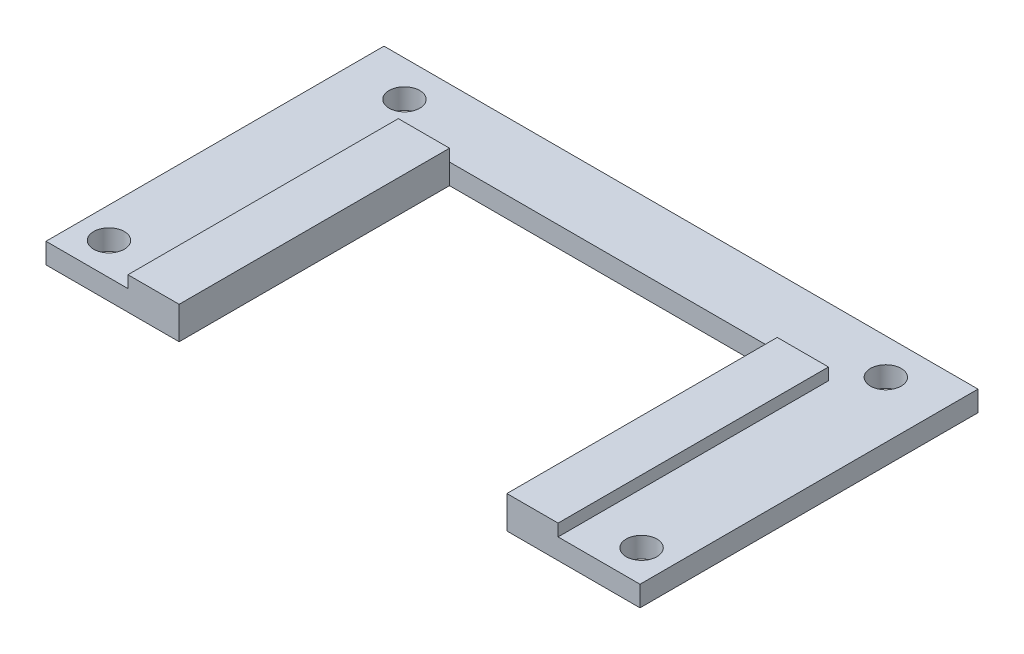
ISO-10303-21;
HEADER;
FILE_DESCRIPTION(('STEP AP214'),'2;1');
FILE_NAME('part.step','',(''),(''),'','','');
FILE_SCHEMA(('AUTOMOTIVE_DESIGN { 1 0 10303 214 1 1 1 1 }'));
ENDSEC;
DATA;
#1=APPLICATION_CONTEXT('core data for automotive mechanical design processes');
#2=APPLICATION_PROTOCOL_DEFINITION('international standard','automotive_design',2000,#1);
#3=PRODUCT_CONTEXT('',#1,'mechanical');
#4=PRODUCT('Part','Part','',(#3));
#5=PRODUCT_RELATED_PRODUCT_CATEGORY('part','',(#4));
#6=PRODUCT_DEFINITION_FORMATION('','',#4);
#7=PRODUCT_DEFINITION_CONTEXT('part definition',#1,'design');
#8=PRODUCT_DEFINITION('design','',#6,#7);
#9=PRODUCT_DEFINITION_SHAPE('','',#8);
#10=(LENGTH_UNIT() NAMED_UNIT(*) SI_UNIT(.MILLI.,.METRE.));
#11=(NAMED_UNIT(*) PLANE_ANGLE_UNIT() SI_UNIT($,.RADIAN.));
#12=(NAMED_UNIT(*) SI_UNIT($,.STERADIAN.) SOLID_ANGLE_UNIT());
#13=UNCERTAINTY_MEASURE_WITH_UNIT(LENGTH_MEASURE(1.E-05),#10,'distance_accuracy_value','');
#14=(GEOMETRIC_REPRESENTATION_CONTEXT(3) GLOBAL_UNCERTAINTY_ASSIGNED_CONTEXT((#13)) GLOBAL_UNIT_ASSIGNED_CONTEXT((#10,
#11,#12)) REPRESENTATION_CONTEXT('',''));
#15=CARTESIAN_POINT('',(0.,0.,0.));
#16=DIRECTION('',(0.,0.,1.));
#17=DIRECTION('',(1.,0.,0.));
#18=AXIS2_PLACEMENT_3D('',#15,#16,#17);
#19=CARTESIAN_POINT('',(0.,2.,0.));
#20=DIRECTION('',(0.,1.,0.));
#21=DIRECTION('',(0.,0.,1.));
#22=AXIS2_PLACEMENT_3D('',#19,#20,#21);
#23=PLANE('',#22);
#24=CARTESIAN_POINT('',(52.,2.,-3.15));
#25=DIRECTION('',(0.,1.,0.));
#26=DIRECTION('',(0.,0.,1.));
#27=AXIS2_PLACEMENT_3D('',#24,#25,#26);
#28=CIRCLE('',#27,1.5);
#29=CARTESIAN_POINT('',(52.,2.,-1.65));
#30=VERTEX_POINT('',#29);
#31=EDGE_CURVE('E243',#30,#30,#28,.T.);
#32=ORIENTED_EDGE('',*,*,#31,.F.);
#33=EDGE_LOOP('',(#32));
#34=FACE_BOUND('',#33,.T.);
#35=CARTESIAN_POINT('',(49.5,2.,-29.5));
#36=DIRECTION('',(0.,1.,0.));
#37=DIRECTION('',(0.,0.,1.));
#38=AXIS2_PLACEMENT_3D('',#35,#36,#37);
#39=CIRCLE('',#38,1.5);
#40=CARTESIAN_POINT('',(49.5,2.,-28.));
#41=VERTEX_POINT('',#40);
#42=EDGE_CURVE('E247',#41,#41,#39,.T.);
#43=ORIENTED_EDGE('',*,*,#42,.F.);
#44=EDGE_LOOP('',(#43));
#45=FACE_BOUND('',#44,.T.);
#46=CARTESIAN_POINT('',(2.5,2.,-29.5));
#47=DIRECTION('',(0.,1.,0.));
#48=DIRECTION('',(0.,0.,1.));
#49=AXIS2_PLACEMENT_3D('',#46,#47,#48);
#50=CIRCLE('',#49,1.5);
#51=CARTESIAN_POINT('',(2.5,2.,-28.));
#52=VERTEX_POINT('',#51);
#53=EDGE_CURVE('E253',#52,#52,#50,.T.);
#54=ORIENTED_EDGE('',*,*,#53,.F.);
#55=EDGE_LOOP('',(#54));
#56=FACE_BOUND('',#55,.T.);
#57=CARTESIAN_POINT('',(0.,2.,-3.15));
#58=DIRECTION('',(0.,1.,0.));
#59=DIRECTION('',(0.,0.,1.));
#60=AXIS2_PLACEMENT_3D('',#57,#58,#59);
#61=CIRCLE('',#60,1.5);
#62=CARTESIAN_POINT('',(0.,2.,-1.65));
#63=VERTEX_POINT('',#62);
#64=EDGE_CURVE('E169',#63,#63,#61,.T.);
#65=ORIENTED_EDGE('',*,*,#64,.F.);
#66=EDGE_LOOP('',(#65));
#67=FACE_BOUND('',#66,.T.);
#68=DIRECTION('',(-1.,0.,0.));
#69=VECTOR('',#68,1.);
#70=CARTESIAN_POINT('',(42.,2.,-26.4));
#71=LINE('',#70,#69);
#72=CARTESIAN_POINT('',(47.,2.,-26.4));
#73=VERTEX_POINT('',#72);
#74=CARTESIAN_POINT('',(42.,2.,-26.4));
#75=VERTEX_POINT('',#74);
#76=EDGE_CURVE('E140',#73,#75,#71,.T.);
#77=ORIENTED_EDGE('',*,*,#76,.F.);
#78=DIRECTION('',(0.,0.,-1.));
#79=VECTOR('',#78,1.);
#80=CARTESIAN_POINT('',(47.,2.,0.));
#81=LINE('',#80,#79);
#82=CARTESIAN_POINT('',(47.,2.,0.));
#83=VERTEX_POINT('',#82);
#84=EDGE_CURVE('E148',#83,#73,#81,.T.);
#85=ORIENTED_EDGE('',*,*,#84,.F.);
#86=DIRECTION('',(-1.,0.,0.));
#87=VECTOR('',#86,1.);
#88=CARTESIAN_POINT('',(0.,2.,0.));
#89=LINE('',#88,#87);
#90=CARTESIAN_POINT('',(55.,2.,0.));
#91=VERTEX_POINT('',#90);
#92=EDGE_CURVE('E262',#91,#83,#89,.T.);
#93=ORIENTED_EDGE('',*,*,#92,.F.);
#94=DIRECTION('',(0.,0.,1.));
#95=VECTOR('',#94,1.);
#96=CARTESIAN_POINT('',(55.,2.,0.));
#97=LINE('',#96,#95);
#98=CARTESIAN_POINT('',(55.,2.,-33.));
#99=VERTEX_POINT('',#98);
#100=EDGE_CURVE('E207',#99,#91,#97,.T.);
#101=ORIENTED_EDGE('',*,*,#100,.F.);
#102=DIRECTION('',(1.,0.,0.));
#103=VECTOR('',#102,1.);
#104=CARTESIAN_POINT('',(0.,2.,-33.));
#105=LINE('',#104,#103);
#106=CARTESIAN_POINT('',(-3.,2.,-33.));
#107=VERTEX_POINT('',#106);
#108=EDGE_CURVE('E267',#107,#99,#105,.T.);
#109=ORIENTED_EDGE('',*,*,#108,.F.);
#110=DIRECTION('',(0.,0.,-1.));
#111=VECTOR('',#110,1.);
#112=CARTESIAN_POINT('',(-3.,2.,0.));
#113=LINE('',#112,#111);
#114=CARTESIAN_POINT('',(-3.,2.,0.));
#115=VERTEX_POINT('',#114);
#116=EDGE_CURVE('E271',#115,#107,#113,.T.);
#117=ORIENTED_EDGE('',*,*,#116,.F.);
#118=DIRECTION('',(-1.,0.,0.));
#119=VECTOR('',#118,1.);
#120=CARTESIAN_POINT('',(0.,2.,0.));
#121=LINE('',#120,#119);
#122=CARTESIAN_POINT('',(5.,2.,0.));
#123=VERTEX_POINT('',#122);
#124=EDGE_CURVE('E69',#123,#115,#121,.T.);
#125=ORIENTED_EDGE('',*,*,#124,.F.);
#126=DIRECTION('',(0.,0.,1.));
#127=VECTOR('',#126,1.);
#128=CARTESIAN_POINT('',(5.,2.,0.));
#129=LINE('',#128,#127);
#130=CARTESIAN_POINT('',(5.,2.,-26.4));
#131=VERTEX_POINT('',#130);
#132=EDGE_CURVE('E308',#131,#123,#129,.T.);
#133=ORIENTED_EDGE('',*,*,#132,.F.);
#134=DIRECTION('',(-1.,0.,0.));
#135=VECTOR('',#134,1.);
#136=CARTESIAN_POINT('',(10.,2.,-26.4));
#137=LINE('',#136,#135);
#138=CARTESIAN_POINT('',(10.,2.,-26.4));
#139=VERTEX_POINT('',#138);
#140=EDGE_CURVE('E164',#139,#131,#137,.T.);
#141=ORIENTED_EDGE('',*,*,#140,.F.);
#142=DIRECTION('',(1.,0.,0.));
#143=VECTOR('',#142,1.);
#144=CARTESIAN_POINT('',(0.,2.,-26.4));
#145=LINE('',#144,#143);
#146=EDGE_CURVE('E162',#139,#75,#145,.T.);
#147=ORIENTED_EDGE('',*,*,#146,.T.);
#148=EDGE_LOOP('',(#77,#85,#93,#101,#109,#117,#125,#133,#141,#147));
#149=FACE_BOUND('',#148,.T.);
#150=ADVANCED_FACE('F45',(#34,#45,#56,#67,#149),#23,.T.);
#151=CARTESIAN_POINT('',(42.,2.,0.));
#152=DIRECTION('',(-1.,0.,0.));
#153=DIRECTION('',(0.,0.,1.));
#154=AXIS2_PLACEMENT_3D('',#151,#152,#153);
#155=PLANE('',#154);
#156=DIRECTION('',(0.,0.,-1.));
#157=VECTOR('',#156,1.);
#158=CARTESIAN_POINT('',(42.,0.,0.));
#159=LINE('',#158,#157);
#160=CARTESIAN_POINT('',(42.,0.,0.));
#161=VERTEX_POINT('',#160);
#162=CARTESIAN_POINT('',(42.,0.,-26.4));
#163=VERTEX_POINT('',#162);
#164=EDGE_CURVE('E217',#161,#163,#159,.T.);
#165=ORIENTED_EDGE('',*,*,#164,.F.);
#166=DIRECTION('',(0.,-1.,0.));
#167=VECTOR('',#166,1.);
#168=CARTESIAN_POINT('',(42.,2.,0.));
#169=LINE('',#168,#167);
#170=CARTESIAN_POINT('',(42.,3.17,0.));
#171=VERTEX_POINT('',#170);
#172=EDGE_CURVE('E11',#171,#161,#169,.T.);
#173=ORIENTED_EDGE('',*,*,#172,.F.);
#174=DIRECTION('',(0.,0.,1.));
#175=VECTOR('',#174,1.);
#176=CARTESIAN_POINT('',(42.,3.17,0.));
#177=LINE('',#176,#175);
#178=CARTESIAN_POINT('',(42.,3.17,-26.4));
#179=VERTEX_POINT('',#178);
#180=EDGE_CURVE('E149',#179,#171,#177,.T.);
#181=ORIENTED_EDGE('',*,*,#180,.F.);
#182=DIRECTION('',(0.,-1.,0.));
#183=VECTOR('',#182,1.);
#184=CARTESIAN_POINT('',(42.,3.17,-26.4));
#185=LINE('',#184,#183);
#186=EDGE_CURVE('E143',#179,#75,#185,.T.);
#187=ORIENTED_EDGE('',*,*,#186,.T.);
#188=DIRECTION('',(0.,-1.,0.));
#189=VECTOR('',#188,1.);
#190=CARTESIAN_POINT('',(42.,2.,-26.4));
#191=LINE('',#190,#189);
#192=EDGE_CURVE('E155',#75,#163,#191,.T.);
#193=ORIENTED_EDGE('',*,*,#192,.T.);
#194=EDGE_LOOP('',(#165,#173,#181,#187,#193));
#195=FACE_BOUND('',#194,.T.);
#196=ADVANCED_FACE('F153',(#195),#155,.T.);
#197=CARTESIAN_POINT('',(0.,2.,0.));
#198=DIRECTION('',(0.,0.,1.));
#199=DIRECTION('',(1.,0.,0.));
#200=AXIS2_PLACEMENT_3D('',#197,#198,#199);
#201=PLANE('',#200);
#202=DIRECTION('',(-1.,0.,0.));
#203=VECTOR('',#202,1.);
#204=CARTESIAN_POINT('',(0.,0.,0.));
#205=LINE('',#204,#203);
#206=CARTESIAN_POINT('',(55.,0.,0.));
#207=VERTEX_POINT('',#206);
#208=EDGE_CURVE('E212',#207,#161,#205,.T.);
#209=ORIENTED_EDGE('',*,*,#208,.F.);
#210=DIRECTION('',(0.,-1.,0.));
#211=VECTOR('',#210,1.);
#212=CARTESIAN_POINT('',(55.,2.,0.));
#213=LINE('',#212,#211);
#214=EDGE_CURVE('E54',#91,#207,#213,.T.);
#215=ORIENTED_EDGE('',*,*,#214,.F.);
#216=ORIENTED_EDGE('',*,*,#92,.T.);
#217=DIRECTION('',(0.,-1.,0.));
#218=VECTOR('',#217,1.);
#219=CARTESIAN_POINT('',(47.,3.17,0.));
#220=LINE('',#219,#218);
#221=CARTESIAN_POINT('',(47.,3.17,0.));
#222=VERTEX_POINT('',#221);
#223=EDGE_CURVE('E292',#222,#83,#220,.T.);
#224=ORIENTED_EDGE('',*,*,#223,.F.);
#225=DIRECTION('',(1.,0.,0.));
#226=VECTOR('',#225,1.);
#227=CARTESIAN_POINT('',(42.,3.17,0.));
#228=LINE('',#227,#226);
#229=EDGE_CURVE('E291',#171,#222,#228,.T.);
#230=ORIENTED_EDGE('',*,*,#229,.F.);
#231=ORIENTED_EDGE('',*,*,#172,.T.);
#232=EDGE_LOOP('',(#209,#215,#216,#224,#230,#231));
#233=FACE_BOUND('',#232,.T.);
#234=ADVANCED_FACE('F213',(#233),#201,.T.);
#235=CARTESIAN_POINT('',(55.,2.,0.));
#236=DIRECTION('',(1.,0.,0.));
#237=DIRECTION('',(0.,0.,-1.));
#238=AXIS2_PLACEMENT_3D('',#235,#236,#237);
#239=PLANE('',#238);
#240=DIRECTION('',(0.,0.,1.));
#241=VECTOR('',#240,1.);
#242=CARTESIAN_POINT('',(55.,0.,0.));
#243=LINE('',#242,#241);
#244=CARTESIAN_POINT('',(55.,0.,-33.));
#245=VERTEX_POINT('',#244);
#246=EDGE_CURVE('E204',#245,#207,#243,.T.);
#247=ORIENTED_EDGE('',*,*,#246,.F.);
#248=DIRECTION('',(0.,-1.,0.));
#249=VECTOR('',#248,1.);
#250=CARTESIAN_POINT('',(55.,2.,-33.));
#251=LINE('',#250,#249);
#252=EDGE_CURVE('E195',#99,#245,#251,.T.);
#253=ORIENTED_EDGE('',*,*,#252,.F.);
#254=ORIENTED_EDGE('',*,*,#100,.T.);
#255=ORIENTED_EDGE('',*,*,#214,.T.);
#256=EDGE_LOOP('',(#247,#253,#254,#255));
#257=FACE_BOUND('',#256,.T.);
#258=ADVANCED_FACE('F202',(#257),#239,.T.);
#259=CARTESIAN_POINT('',(0.,2.,-33.));
#260=DIRECTION('',(0.,0.,-1.));
#261=DIRECTION('',(-1.,0.,0.));
#262=AXIS2_PLACEMENT_3D('',#259,#260,#261);
#263=PLANE('',#262);
#264=DIRECTION('',(1.,0.,0.));
#265=VECTOR('',#264,1.);
#266=CARTESIAN_POINT('',(0.,0.,-33.));
#267=LINE('',#266,#265);
#268=CARTESIAN_POINT('',(-3.,0.,-33.));
#269=VERTEX_POINT('',#268);
#270=EDGE_CURVE('E223',#269,#245,#267,.T.);
#271=ORIENTED_EDGE('',*,*,#270,.F.);
#272=DIRECTION('',(0.,-1.,0.));
#273=VECTOR('',#272,1.);
#274=CARTESIAN_POINT('',(-3.,2.,-33.));
#275=LINE('',#274,#273);
#276=EDGE_CURVE('E192',#107,#269,#275,.T.);
#277=ORIENTED_EDGE('',*,*,#276,.F.);
#278=ORIENTED_EDGE('',*,*,#108,.T.);
#279=ORIENTED_EDGE('',*,*,#252,.T.);
#280=EDGE_LOOP('',(#271,#277,#278,#279));
#281=FACE_BOUND('',#280,.T.);
#282=ADVANCED_FACE('F349',(#281),#263,.T.);
#283=CARTESIAN_POINT('',(-3.,2.,0.));
#284=DIRECTION('',(-1.,0.,0.));
#285=DIRECTION('',(0.,0.,1.));
#286=AXIS2_PLACEMENT_3D('',#283,#284,#285);
#287=PLANE('',#286);
#288=DIRECTION('',(0.,0.,-1.));
#289=VECTOR('',#288,1.);
#290=CARTESIAN_POINT('',(-3.,0.,0.));
#291=LINE('',#290,#289);
#292=CARTESIAN_POINT('',(-3.,0.,0.));
#293=VERTEX_POINT('',#292);
#294=EDGE_CURVE('E227',#293,#269,#291,.T.);
#295=ORIENTED_EDGE('',*,*,#294,.F.);
#296=DIRECTION('',(0.,-1.,0.));
#297=VECTOR('',#296,1.);
#298=CARTESIAN_POINT('',(-3.,2.,0.));
#299=LINE('',#298,#297);
#300=EDGE_CURVE('E189',#115,#293,#299,.T.);
#301=ORIENTED_EDGE('',*,*,#300,.F.);
#302=ORIENTED_EDGE('',*,*,#116,.T.);
#303=ORIENTED_EDGE('',*,*,#276,.T.);
#304=EDGE_LOOP('',(#295,#301,#302,#303));
#305=FACE_BOUND('',#304,.T.);
#306=ADVANCED_FACE('F346',(#305),#287,.T.);
#307=CARTESIAN_POINT('',(0.,2.,0.));
#308=DIRECTION('',(0.,0.,1.));
#309=DIRECTION('',(1.,0.,0.));
#310=AXIS2_PLACEMENT_3D('',#307,#308,#309);
#311=PLANE('',#310);
#312=DIRECTION('',(-1.,0.,0.));
#313=VECTOR('',#312,1.);
#314=CARTESIAN_POINT('',(0.,0.,0.));
#315=LINE('',#314,#313);
#316=CARTESIAN_POINT('',(10.,0.,0.));
#317=VERTEX_POINT('',#316);
#318=EDGE_CURVE('E233',#317,#293,#315,.T.);
#319=ORIENTED_EDGE('',*,*,#318,.F.);
#320=DIRECTION('',(0.,-1.,0.));
#321=VECTOR('',#320,1.);
#322=CARTESIAN_POINT('',(10.,2.,0.));
#323=LINE('',#322,#321);
#324=CARTESIAN_POINT('',(10.,3.17,0.));
#325=VERTEX_POINT('',#324);
#326=EDGE_CURVE('E179',#325,#317,#323,.T.);
#327=ORIENTED_EDGE('',*,*,#326,.F.);
#328=DIRECTION('',(1.,0.,0.));
#329=VECTOR('',#328,1.);
#330=CARTESIAN_POINT('',(10.,3.17,0.));
#331=LINE('',#330,#329);
#332=CARTESIAN_POINT('',(5.,3.17,0.));
#333=VERTEX_POINT('',#332);
#334=EDGE_CURVE('E314',#333,#325,#331,.T.);
#335=ORIENTED_EDGE('',*,*,#334,.F.);
#336=DIRECTION('',(0.,-1.,0.));
#337=VECTOR('',#336,1.);
#338=CARTESIAN_POINT('',(5.,3.17,0.));
#339=LINE('',#338,#337);
#340=EDGE_CURVE('E318',#333,#123,#339,.T.);
#341=ORIENTED_EDGE('',*,*,#340,.T.);
#342=ORIENTED_EDGE('',*,*,#124,.T.);
#343=ORIENTED_EDGE('',*,*,#300,.T.);
#344=EDGE_LOOP('',(#319,#327,#335,#341,#342,#343));
#345=FACE_BOUND('',#344,.T.);
#346=ADVANCED_FACE('F341',(#345),#311,.T.);
#347=CARTESIAN_POINT('',(10.,2.,0.));
#348=DIRECTION('',(-1.,0.,0.));
#349=DIRECTION('',(0.,0.,1.));
#350=AXIS2_PLACEMENT_3D('',#347,#348,#349);
#351=PLANE('',#350);
#352=DIRECTION('',(0.,0.,-1.));
#353=VECTOR('',#352,1.);
#354=CARTESIAN_POINT('',(10.,0.,0.));
#355=LINE('',#354,#353);
#356=CARTESIAN_POINT('',(10.,0.,-26.4));
#357=VERTEX_POINT('',#356);
#358=EDGE_CURVE('E237',#317,#357,#355,.T.);
#359=ORIENTED_EDGE('',*,*,#358,.T.);
#360=DIRECTION('',(0.,-1.,0.));
#361=VECTOR('',#360,1.);
#362=CARTESIAN_POINT('',(10.,2.,-26.4));
#363=LINE('',#362,#361);
#364=EDGE_CURVE('E175',#139,#357,#363,.T.);
#365=ORIENTED_EDGE('',*,*,#364,.F.);
#366=DIRECTION('',(0.,-1.,0.));
#367=VECTOR('',#366,1.);
#368=CARTESIAN_POINT('',(10.,3.17,-26.4));
#369=LINE('',#368,#367);
#370=CARTESIAN_POINT('',(10.,3.17,-26.4));
#371=VERTEX_POINT('',#370);
#372=EDGE_CURVE('E256',#371,#139,#369,.T.);
#373=ORIENTED_EDGE('',*,*,#372,.F.);
#374=DIRECTION('',(0.,0.,-1.));
#375=VECTOR('',#374,1.);
#376=CARTESIAN_POINT('',(10.,3.17,0.));
#377=LINE('',#376,#375);
#378=EDGE_CURVE('E303',#325,#371,#377,.T.);
#379=ORIENTED_EDGE('',*,*,#378,.F.);
#380=ORIENTED_EDGE('',*,*,#326,.T.);
#381=EDGE_LOOP('',(#359,#365,#373,#379,#380));
#382=FACE_BOUND('',#381,.T.);
#383=ADVANCED_FACE('F338',(#382),#351,.F.);
#384=CARTESIAN_POINT('',(0.,2.,-26.4));
#385=DIRECTION('',(0.,0.,-1.));
#386=DIRECTION('',(-1.,0.,0.));
#387=AXIS2_PLACEMENT_3D('',#384,#385,#386);
#388=PLANE('',#387);
#389=DIRECTION('',(1.,0.,0.));
#390=VECTOR('',#389,1.);
#391=CARTESIAN_POINT('',(0.,0.,-26.4));
#392=LINE('',#391,#390);
#393=EDGE_CURVE('E172',#357,#163,#392,.T.);
#394=ORIENTED_EDGE('',*,*,#393,.T.);
#395=ORIENTED_EDGE('',*,*,#192,.F.);
#396=ORIENTED_EDGE('',*,*,#146,.F.);
#397=ORIENTED_EDGE('',*,*,#364,.T.);
#398=EDGE_LOOP('',(#394,#395,#396,#397));
#399=FACE_BOUND('',#398,.T.);
#400=ADVANCED_FACE('F171',(#399),#388,.F.);
#401=CARTESIAN_POINT('',(2.5,2.,-29.5));
#402=DIRECTION('',(0.,-1.,0.));
#403=DIRECTION('',(0.,0.,-1.));
#404=AXIS2_PLACEMENT_3D('',#401,#402,#403);
#405=CYLINDRICAL_SURFACE('',#404,1.5);
#406=ORIENTED_EDGE('',*,*,#53,.T.);
#407=EDGE_LOOP('',(#406));
#408=FACE_BOUND('',#407,.T.);
#409=CARTESIAN_POINT('',(2.5,0.,-29.5));
#410=DIRECTION('',(0.,1.,0.));
#411=DIRECTION('',(0.,0.,1.));
#412=AXIS2_PLACEMENT_3D('',#409,#410,#411);
#413=CIRCLE('',#412,1.5);
#414=CARTESIAN_POINT('',(2.5,0.,-28.));
#415=VERTEX_POINT('',#414);
#416=EDGE_CURVE('E285',#415,#415,#413,.T.);
#417=ORIENTED_EDGE('',*,*,#416,.F.);
#418=EDGE_LOOP('',(#417));
#419=FACE_BOUND('',#418,.T.);
#420=ADVANCED_FACE('F394',(#408,#419),#405,.F.);
#421=CARTESIAN_POINT('',(49.5,2.,-29.5));
#422=DIRECTION('',(0.,-1.,0.));
#423=DIRECTION('',(0.,0.,-1.));
#424=AXIS2_PLACEMENT_3D('',#421,#422,#423);
#425=CYLINDRICAL_SURFACE('',#424,1.5);
#426=ORIENTED_EDGE('',*,*,#42,.T.);
#427=EDGE_LOOP('',(#426));
#428=FACE_BOUND('',#427,.T.);
#429=CARTESIAN_POINT('',(49.5,0.,-29.5));
#430=DIRECTION('',(0.,1.,0.));
#431=DIRECTION('',(0.,0.,1.));
#432=AXIS2_PLACEMENT_3D('',#429,#430,#431);
#433=CIRCLE('',#432,1.5);
#434=CARTESIAN_POINT('',(49.5,0.,-28.));
#435=VERTEX_POINT('',#434);
#436=EDGE_CURVE('E281',#435,#435,#433,.T.);
#437=ORIENTED_EDGE('',*,*,#436,.F.);
#438=EDGE_LOOP('',(#437));
#439=FACE_BOUND('',#438,.T.);
#440=ADVANCED_FACE('F408',(#428,#439),#425,.F.);
#441=CARTESIAN_POINT('',(52.,2.,-3.15));
#442=DIRECTION('',(0.,-1.,0.));
#443=DIRECTION('',(0.,0.,-1.));
#444=AXIS2_PLACEMENT_3D('',#441,#442,#443);
#445=CYLINDRICAL_SURFACE('',#444,1.5);
#446=ORIENTED_EDGE('',*,*,#31,.T.);
#447=EDGE_LOOP('',(#446));
#448=FACE_BOUND('',#447,.T.);
#449=CARTESIAN_POINT('',(52.,0.,-3.15));
#450=DIRECTION('',(0.,1.,0.));
#451=DIRECTION('',(0.,0.,1.));
#452=AXIS2_PLACEMENT_3D('',#449,#450,#451);
#453=CIRCLE('',#452,1.5);
#454=CARTESIAN_POINT('',(52.,0.,-1.65));
#455=VERTEX_POINT('',#454);
#456=EDGE_CURVE('E277',#455,#455,#453,.T.);
#457=ORIENTED_EDGE('',*,*,#456,.F.);
#458=EDGE_LOOP('',(#457));
#459=FACE_BOUND('',#458,.T.);
#460=ADVANCED_FACE('F47',(#448,#459),#445,.F.);
#461=CARTESIAN_POINT('',(0.,2.,-3.15));
#462=DIRECTION('',(0.,-1.,0.));
#463=DIRECTION('',(0.,0.,-1.));
#464=AXIS2_PLACEMENT_3D('',#461,#462,#463);
#465=CYLINDRICAL_SURFACE('',#464,1.5);
#466=ORIENTED_EDGE('',*,*,#64,.T.);
#467=EDGE_LOOP('',(#466));
#468=FACE_BOUND('',#467,.T.);
#469=CARTESIAN_POINT('',(0.,0.,-3.15));
#470=DIRECTION('',(0.,1.,0.));
#471=DIRECTION('',(0.,0.,1.));
#472=AXIS2_PLACEMENT_3D('',#469,#470,#471);
#473=CIRCLE('',#472,1.5);
#474=CARTESIAN_POINT('',(0.,0.,-1.65));
#475=VERTEX_POINT('',#474);
#476=EDGE_CURVE('E184',#475,#475,#473,.T.);
#477=ORIENTED_EDGE('',*,*,#476,.F.);
#478=EDGE_LOOP('',(#477));
#479=FACE_BOUND('',#478,.T.);
#480=ADVANCED_FACE('F387',(#468,#479),#465,.F.);
#481=CARTESIAN_POINT('',(0.,0.,0.));
#482=DIRECTION('',(0.,1.,0.));
#483=DIRECTION('',(0.,0.,1.));
#484=AXIS2_PLACEMENT_3D('',#481,#482,#483);
#485=PLANE('',#484);
#486=ORIENTED_EDGE('',*,*,#456,.T.);
#487=EDGE_LOOP('',(#486));
#488=FACE_BOUND('',#487,.T.);
#489=ORIENTED_EDGE('',*,*,#436,.T.);
#490=EDGE_LOOP('',(#489));
#491=FACE_BOUND('',#490,.T.);
#492=ORIENTED_EDGE('',*,*,#416,.T.);
#493=EDGE_LOOP('',(#492));
#494=FACE_BOUND('',#493,.T.);
#495=ORIENTED_EDGE('',*,*,#164,.T.);
#496=ORIENTED_EDGE('',*,*,#393,.F.);
#497=ORIENTED_EDGE('',*,*,#358,.F.);
#498=ORIENTED_EDGE('',*,*,#318,.T.);
#499=ORIENTED_EDGE('',*,*,#294,.T.);
#500=ORIENTED_EDGE('',*,*,#270,.T.);
#501=ORIENTED_EDGE('',*,*,#246,.T.);
#502=ORIENTED_EDGE('',*,*,#208,.T.);
#503=EDGE_LOOP('',(#495,#496,#497,#498,#499,#500,#501,#502));
#504=FACE_BOUND('',#503,.T.);
#505=ORIENTED_EDGE('',*,*,#476,.T.);
#506=EDGE_LOOP('',(#505));
#507=FACE_BOUND('',#506,.T.);
#508=ADVANCED_FACE('F219',(#488,#491,#494,#504,#507),#485,.F.);
#509=CARTESIAN_POINT('',(10.,3.17,-26.4));
#510=DIRECTION('',(0.,0.,1.));
#511=DIRECTION('',(1.,0.,0.));
#512=AXIS2_PLACEMENT_3D('',#509,#510,#511);
#513=PLANE('',#512);
#514=ORIENTED_EDGE('',*,*,#140,.T.);
#515=DIRECTION('',(0.,-1.,0.));
#516=VECTOR('',#515,1.);
#517=CARTESIAN_POINT('',(5.,3.17,-26.4));
#518=LINE('',#517,#516);
#519=CARTESIAN_POINT('',(5.,3.17,-26.4));
#520=VERTEX_POINT('',#519);
#521=EDGE_CURVE('E325',#520,#131,#518,.T.);
#522=ORIENTED_EDGE('',*,*,#521,.F.);
#523=DIRECTION('',(-1.,0.,0.));
#524=VECTOR('',#523,1.);
#525=CARTESIAN_POINT('',(10.,3.17,-26.4));
#526=LINE('',#525,#524);
#527=EDGE_CURVE('E307',#371,#520,#526,.T.);
#528=ORIENTED_EDGE('',*,*,#527,.F.);
#529=ORIENTED_EDGE('',*,*,#372,.T.);
#530=EDGE_LOOP('',(#514,#522,#528,#529));
#531=FACE_BOUND('',#530,.T.);
#532=ADVANCED_FACE('F335',(#531),#513,.F.);
#533=CARTESIAN_POINT('',(5.,3.17,0.));
#534=DIRECTION('',(1.,0.,0.));
#535=DIRECTION('',(0.,0.,-1.));
#536=AXIS2_PLACEMENT_3D('',#533,#534,#535);
#537=PLANE('',#536);
#538=ORIENTED_EDGE('',*,*,#132,.T.);
#539=ORIENTED_EDGE('',*,*,#340,.F.);
#540=DIRECTION('',(0.,0.,1.));
#541=VECTOR('',#540,1.);
#542=CARTESIAN_POINT('',(5.,3.17,0.));
#543=LINE('',#542,#541);
#544=EDGE_CURVE('E311',#520,#333,#543,.T.);
#545=ORIENTED_EDGE('',*,*,#544,.F.);
#546=ORIENTED_EDGE('',*,*,#521,.T.);
#547=EDGE_LOOP('',(#538,#539,#545,#546));
#548=FACE_BOUND('',#547,.T.);
#549=ADVANCED_FACE('F369',(#548),#537,.F.);
#550=CARTESIAN_POINT('',(0.,3.17,0.));
#551=DIRECTION('',(0.,1.,0.));
#552=DIRECTION('',(0.,0.,1.));
#553=AXIS2_PLACEMENT_3D('',#550,#551,#552);
#554=PLANE('',#553);
#555=ORIENTED_EDGE('',*,*,#378,.T.);
#556=ORIENTED_EDGE('',*,*,#527,.T.);
#557=ORIENTED_EDGE('',*,*,#544,.T.);
#558=ORIENTED_EDGE('',*,*,#334,.T.);
#559=EDGE_LOOP('',(#555,#556,#557,#558));
#560=FACE_BOUND('',#559,.T.);
#561=ADVANCED_FACE('F362',(#560),#554,.T.);
#562=CARTESIAN_POINT('',(47.,3.17,0.));
#563=DIRECTION('',(-1.,0.,0.));
#564=DIRECTION('',(0.,0.,1.));
#565=AXIS2_PLACEMENT_3D('',#562,#563,#564);
#566=PLANE('',#565);
#567=ORIENTED_EDGE('',*,*,#84,.T.);
#568=DIRECTION('',(0.,-1.,0.));
#569=VECTOR('',#568,1.);
#570=CARTESIAN_POINT('',(47.,3.17,-26.4));
#571=LINE('',#570,#569);
#572=CARTESIAN_POINT('',(47.,3.17,-26.4));
#573=VERTEX_POINT('',#572);
#574=EDGE_CURVE('E61',#573,#73,#571,.T.);
#575=ORIENTED_EDGE('',*,*,#574,.F.);
#576=DIRECTION('',(0.,0.,-1.));
#577=VECTOR('',#576,1.);
#578=CARTESIAN_POINT('',(47.,3.17,0.));
#579=LINE('',#578,#577);
#580=EDGE_CURVE('E296',#222,#573,#579,.T.);
#581=ORIENTED_EDGE('',*,*,#580,.F.);
#582=ORIENTED_EDGE('',*,*,#223,.T.);
#583=EDGE_LOOP('',(#567,#575,#581,#582));
#584=FACE_BOUND('',#583,.T.);
#585=ADVANCED_FACE('F356',(#584),#566,.F.);
#586=CARTESIAN_POINT('',(42.,3.17,-26.4));
#587=DIRECTION('',(0.,0.,1.));
#588=DIRECTION('',(1.,0.,0.));
#589=AXIS2_PLACEMENT_3D('',#586,#587,#588);
#590=PLANE('',#589);
#591=ORIENTED_EDGE('',*,*,#76,.T.);
#592=ORIENTED_EDGE('',*,*,#186,.F.);
#593=DIRECTION('',(-1.,0.,0.));
#594=VECTOR('',#593,1.);
#595=CARTESIAN_POINT('',(42.,3.17,-26.4));
#596=LINE('',#595,#594);
#597=EDGE_CURVE('E159',#573,#179,#596,.T.);
#598=ORIENTED_EDGE('',*,*,#597,.F.);
#599=ORIENTED_EDGE('',*,*,#574,.T.);
#600=EDGE_LOOP('',(#591,#592,#598,#599));
#601=FACE_BOUND('',#600,.T.);
#602=ADVANCED_FACE('F142',(#601),#590,.F.);
#603=CARTESIAN_POINT('',(0.,3.17,0.));
#604=DIRECTION('',(0.,-1.,0.));
#605=DIRECTION('',(0.,0.,-1.));
#606=AXIS2_PLACEMENT_3D('',#603,#604,#605);
#607=PLANE('',#606);
#608=ORIENTED_EDGE('',*,*,#180,.T.);
#609=ORIENTED_EDGE('',*,*,#229,.T.);
#610=ORIENTED_EDGE('',*,*,#580,.T.);
#611=ORIENTED_EDGE('',*,*,#597,.T.);
#612=EDGE_LOOP('',(#608,#609,#610,#611));
#613=FACE_BOUND('',#612,.T.);
#614=ADVANCED_FACE('F298',(#613),#607,.F.);
#615=CLOSED_SHELL('',(#150,#196,#234,#258,#282,#306,#346,#383,#400,#420,#440,#460,#480,#508,
#532,#549,#561,#585,#602,#614));
#616=MANIFOLD_SOLID_BREP('B2',#615);
#617=ADVANCED_BREP_SHAPE_REPRESENTATION('',(#18,#616),#14);
#618=SHAPE_DEFINITION_REPRESENTATION(#9,#617);
ENDSEC;
END-ISO-10303-21;
